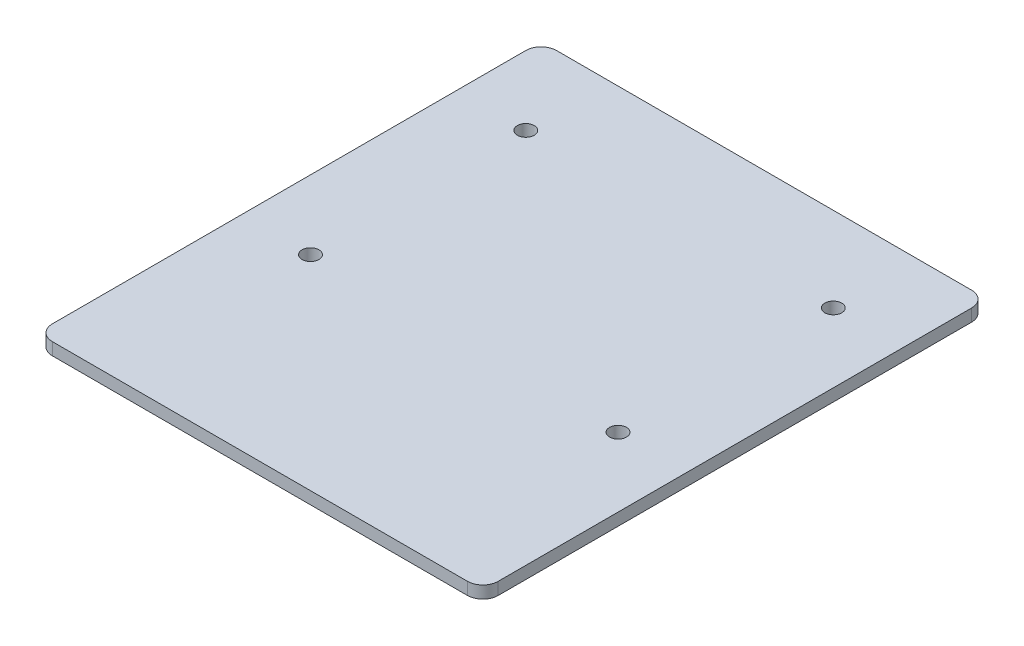
ISO-10303-21;
HEADER;
FILE_DESCRIPTION(('STEP AP214'),'2;1');
FILE_NAME('part.step','',(''),(''),'','','');
FILE_SCHEMA(('AUTOMOTIVE_DESIGN { 1 0 10303 214 1 1 1 1 }'));
ENDSEC;
DATA;
#1=APPLICATION_CONTEXT('core data for automotive mechanical design processes');
#2=APPLICATION_PROTOCOL_DEFINITION('international standard','automotive_design',2000,#1);
#3=PRODUCT_CONTEXT('',#1,'mechanical');
#4=PRODUCT('Part','Part','',(#3));
#5=PRODUCT_RELATED_PRODUCT_CATEGORY('part','',(#4));
#6=PRODUCT_DEFINITION_FORMATION('','',#4);
#7=PRODUCT_DEFINITION_CONTEXT('part definition',#1,'design');
#8=PRODUCT_DEFINITION('design','',#6,#7);
#9=PRODUCT_DEFINITION_SHAPE('','',#8);
#10=(LENGTH_UNIT() NAMED_UNIT(*) SI_UNIT(.MILLI.,.METRE.));
#11=(NAMED_UNIT(*) PLANE_ANGLE_UNIT() SI_UNIT($,.RADIAN.));
#12=(NAMED_UNIT(*) SI_UNIT($,.STERADIAN.) SOLID_ANGLE_UNIT());
#13=UNCERTAINTY_MEASURE_WITH_UNIT(LENGTH_MEASURE(1.E-05),#10,'distance_accuracy_value','');
#14=(GEOMETRIC_REPRESENTATION_CONTEXT(3) GLOBAL_UNCERTAINTY_ASSIGNED_CONTEXT((#13)) GLOBAL_UNIT_ASSIGNED_CONTEXT((#10,
#11,#12)) REPRESENTATION_CONTEXT('',''));
#15=CARTESIAN_POINT('',(0.,0.,0.));
#16=DIRECTION('',(0.,0.,1.));
#17=DIRECTION('',(1.,0.,0.));
#18=AXIS2_PLACEMENT_3D('',#15,#16,#17);
#19=CARTESIAN_POINT('',(-72.5,4.,-19.5));
#20=DIRECTION('',(1.,0.,0.));
#21=DIRECTION('',(0.,0.,-1.));
#22=AXIS2_PLACEMENT_3D('',#19,#20,#21);
#23=PLANE('',#22);
#24=DIRECTION('',(0.,0.,1.));
#25=VECTOR('',#24,1.);
#26=CARTESIAN_POINT('',(-72.5,4.,-19.5));
#27=LINE('',#26,#25);
#28=CARTESIAN_POINT('',(-72.5,4.,-14.5));
#29=VERTEX_POINT('',#28);
#30=CARTESIAN_POINT('',(-72.5,4.,139.465714830308));
#31=VERTEX_POINT('',#30);
#32=EDGE_CURVE('E127',#29,#31,#27,.T.);
#33=ORIENTED_EDGE('',*,*,#32,.F.);
#34=DIRECTION('',(0.,-1.,0.));
#35=VECTOR('',#34,1.);
#36=CARTESIAN_POINT('',(-72.5,4.,-14.5));
#37=LINE('',#36,#35);
#38=CARTESIAN_POINT('',(-72.5,0.,-14.5));
#39=VERTEX_POINT('',#38);
#40=EDGE_CURVE('E111',#29,#39,#37,.T.);
#41=ORIENTED_EDGE('',*,*,#40,.T.);
#42=DIRECTION('',(0.,0.,1.));
#43=VECTOR('',#42,1.);
#44=CARTESIAN_POINT('',(-72.5,0.,-19.5));
#45=LINE('',#44,#43);
#46=CARTESIAN_POINT('',(-72.5,0.,139.465714830308));
#47=VERTEX_POINT('',#46);
#48=EDGE_CURVE('E124',#39,#47,#45,.T.);
#49=ORIENTED_EDGE('',*,*,#48,.T.);
#50=DIRECTION('',(0.,-1.,0.));
#51=VECTOR('',#50,1.);
#52=CARTESIAN_POINT('',(-72.5,4.,139.465714830308));
#53=LINE('',#52,#51);
#54=EDGE_CURVE('E129',#47,#31,#53,.F.);
#55=ORIENTED_EDGE('',*,*,#54,.T.);
#56=EDGE_LOOP('',(#33,#41,#49,#55));
#57=FACE_BOUND('',#56,.T.);
#58=ADVANCED_FACE('F41',(#57),#23,.F.);
#59=CARTESIAN_POINT('',(-72.5,4.,144.465714830308));
#60=DIRECTION('',(0.,0.,-1.));
#61=DIRECTION('',(-1.,0.,0.));
#62=AXIS2_PLACEMENT_3D('',#59,#60,#61);
#63=PLANE('',#62);
#64=DIRECTION('',(1.,0.,0.));
#65=VECTOR('',#64,1.);
#66=CARTESIAN_POINT('',(-72.5,0.,144.465714830308));
#67=LINE('',#66,#65);
#68=CARTESIAN_POINT('',(-67.5,0.,144.465714830308));
#69=VERTEX_POINT('',#68);
#70=CARTESIAN_POINT('',(67.5,0.,144.465714830308));
#71=VERTEX_POINT('',#70);
#72=EDGE_CURVE('E135',#69,#71,#67,.T.);
#73=ORIENTED_EDGE('',*,*,#72,.T.);
#74=DIRECTION('',(0.,-1.,0.));
#75=VECTOR('',#74,1.);
#76=CARTESIAN_POINT('',(67.5,4.,144.465714830308));
#77=LINE('',#76,#75);
#78=CARTESIAN_POINT('',(67.5,4.,144.465714830308));
#79=VERTEX_POINT('',#78);
#80=EDGE_CURVE('E11',#71,#79,#77,.F.);
#81=ORIENTED_EDGE('',*,*,#80,.T.);
#82=DIRECTION('',(1.,0.,0.));
#83=VECTOR('',#82,1.);
#84=CARTESIAN_POINT('',(-72.5,4.,144.465714830308));
#85=LINE('',#84,#83);
#86=CARTESIAN_POINT('',(-67.5,4.,144.465714830308));
#87=VERTEX_POINT('',#86);
#88=EDGE_CURVE('E175',#87,#79,#85,.T.);
#89=ORIENTED_EDGE('',*,*,#88,.F.);
#90=DIRECTION('',(0.,-1.,0.));
#91=VECTOR('',#90,1.);
#92=CARTESIAN_POINT('',(-67.5,4.,144.465714830308));
#93=LINE('',#92,#91);
#94=EDGE_CURVE('E47',#87,#69,#93,.T.);
#95=ORIENTED_EDGE('',*,*,#94,.T.);
#96=EDGE_LOOP('',(#73,#81,#89,#95));
#97=FACE_BOUND('',#96,.T.);
#98=ADVANCED_FACE('F167',(#97),#63,.F.);
#99=CARTESIAN_POINT('',(72.5,4.,-19.5));
#100=DIRECTION('',(-1.,0.,0.));
#101=DIRECTION('',(0.,0.,1.));
#102=AXIS2_PLACEMENT_3D('',#99,#100,#101);
#103=PLANE('',#102);
#104=DIRECTION('',(0.,0.,-1.));
#105=VECTOR('',#104,1.);
#106=CARTESIAN_POINT('',(72.5,0.,-19.5));
#107=LINE('',#106,#105);
#108=CARTESIAN_POINT('',(72.5,0.,139.465714830308));
#109=VERTEX_POINT('',#108);
#110=CARTESIAN_POINT('',(72.5,0.,-14.5));
#111=VERTEX_POINT('',#110);
#112=EDGE_CURVE('E138',#109,#111,#107,.T.);
#113=ORIENTED_EDGE('',*,*,#112,.T.);
#114=DIRECTION('',(0.,-1.,0.));
#115=VECTOR('',#114,1.);
#116=CARTESIAN_POINT('',(72.5,4.,-14.5));
#117=LINE('',#116,#115);
#118=CARTESIAN_POINT('',(72.5,4.,-14.5));
#119=VERTEX_POINT('',#118);
#120=EDGE_CURVE('E57',#111,#119,#117,.F.);
#121=ORIENTED_EDGE('',*,*,#120,.T.);
#122=DIRECTION('',(0.,0.,-1.));
#123=VECTOR('',#122,1.);
#124=CARTESIAN_POINT('',(72.5,4.,-19.5));
#125=LINE('',#124,#123);
#126=CARTESIAN_POINT('',(72.5,4.,139.465714830308));
#127=VERTEX_POINT('',#126);
#128=EDGE_CURVE('E179',#127,#119,#125,.T.);
#129=ORIENTED_EDGE('',*,*,#128,.F.);
#130=DIRECTION('',(0.,-1.,0.));
#131=VECTOR('',#130,1.);
#132=CARTESIAN_POINT('',(72.5,4.,139.465714830308));
#133=LINE('',#132,#131);
#134=EDGE_CURVE('E161',#127,#109,#133,.T.);
#135=ORIENTED_EDGE('',*,*,#134,.T.);
#136=EDGE_LOOP('',(#113,#121,#129,#135));
#137=FACE_BOUND('',#136,.T.);
#138=ADVANCED_FACE('F177',(#137),#103,.F.);
#139=CARTESIAN_POINT('',(-72.5,4.,-19.5));
#140=DIRECTION('',(0.,0.,1.));
#141=DIRECTION('',(1.,0.,0.));
#142=AXIS2_PLACEMENT_3D('',#139,#140,#141);
#143=PLANE('',#142);
#144=DIRECTION('',(-1.,0.,0.));
#145=VECTOR('',#144,1.);
#146=CARTESIAN_POINT('',(-72.5,0.,-19.5));
#147=LINE('',#146,#145);
#148=CARTESIAN_POINT('',(67.5,0.,-19.5));
#149=VERTEX_POINT('',#148);
#150=CARTESIAN_POINT('',(-67.5,0.,-19.5));
#151=VERTEX_POINT('',#150);
#152=EDGE_CURVE('E147',#149,#151,#147,.T.);
#153=ORIENTED_EDGE('',*,*,#152,.T.);
#154=DIRECTION('',(0.,-1.,0.));
#155=VECTOR('',#154,1.);
#156=CARTESIAN_POINT('',(-67.5,4.,-19.5));
#157=LINE('',#156,#155);
#158=CARTESIAN_POINT('',(-67.5,4.,-19.5));
#159=VERTEX_POINT('',#158);
#160=EDGE_CURVE('E115',#151,#159,#157,.F.);
#161=ORIENTED_EDGE('',*,*,#160,.T.);
#162=DIRECTION('',(-1.,0.,0.));
#163=VECTOR('',#162,1.);
#164=CARTESIAN_POINT('',(-72.5,4.,-19.5));
#165=LINE('',#164,#163);
#166=CARTESIAN_POINT('',(67.5,4.,-19.5));
#167=VERTEX_POINT('',#166);
#168=EDGE_CURVE('E145',#167,#159,#165,.T.);
#169=ORIENTED_EDGE('',*,*,#168,.F.);
#170=DIRECTION('',(0.,-1.,0.));
#171=VECTOR('',#170,1.);
#172=CARTESIAN_POINT('',(67.5,4.,-19.5));
#173=LINE('',#172,#171);
#174=EDGE_CURVE('E120',#167,#149,#173,.T.);
#175=ORIENTED_EDGE('',*,*,#174,.T.);
#176=EDGE_LOOP('',(#153,#161,#169,#175));
#177=FACE_BOUND('',#176,.T.);
#178=ADVANCED_FACE('F215',(#177),#143,.F.);
#179=CARTESIAN_POINT('',(0.,4.,0.));
#180=DIRECTION('',(0.,1.,0.));
#181=DIRECTION('',(0.,0.,1.));
#182=AXIS2_PLACEMENT_3D('',#179,#180,#181);
#183=PLANE('',#182);
#184=CARTESIAN_POINT('',(-50.,4.,78.));
#185=DIRECTION('',(0.,1.,0.));
#186=DIRECTION('',(0.,0.,1.));
#187=AXIS2_PLACEMENT_3D('',#184,#185,#186);
#188=CIRCLE('',#187,2.75);
#189=CARTESIAN_POINT('',(-50.,4.,80.75));
#190=VERTEX_POINT('',#189);
#191=EDGE_CURVE('E190',#190,#190,#188,.T.);
#192=ORIENTED_EDGE('',*,*,#191,.F.);
#193=EDGE_LOOP('',(#192));
#194=FACE_BOUND('',#193,.T.);
#195=CARTESIAN_POINT('',(50.,4.,8.));
#196=DIRECTION('',(0.,1.,0.));
#197=DIRECTION('',(0.,0.,1.));
#198=AXIS2_PLACEMENT_3D('',#195,#196,#197);
#199=CIRCLE('',#198,2.75);
#200=CARTESIAN_POINT('',(50.,4.,10.75));
#201=VERTEX_POINT('',#200);
#202=EDGE_CURVE('E195',#201,#201,#199,.T.);
#203=ORIENTED_EDGE('',*,*,#202,.F.);
#204=EDGE_LOOP('',(#203));
#205=FACE_BOUND('',#204,.T.);
#206=CARTESIAN_POINT('',(50.,4.,78.));
#207=DIRECTION('',(0.,1.,0.));
#208=DIRECTION('',(0.,0.,1.));
#209=AXIS2_PLACEMENT_3D('',#206,#207,#208);
#210=CIRCLE('',#209,2.75);
#211=CARTESIAN_POINT('',(50.,4.,80.75));
#212=VERTEX_POINT('',#211);
#213=EDGE_CURVE('E194',#212,#212,#210,.T.);
#214=ORIENTED_EDGE('',*,*,#213,.F.);
#215=EDGE_LOOP('',(#214));
#216=FACE_BOUND('',#215,.T.);
#217=CARTESIAN_POINT('',(-50.,4.,8.));
#218=DIRECTION('',(0.,1.,0.));
#219=DIRECTION('',(0.,0.,1.));
#220=AXIS2_PLACEMENT_3D('',#217,#218,#219);
#221=CIRCLE('',#220,2.75);
#222=CARTESIAN_POINT('',(-50.,4.,10.75));
#223=VERTEX_POINT('',#222);
#224=EDGE_CURVE('E139',#223,#223,#221,.T.);
#225=ORIENTED_EDGE('',*,*,#224,.F.);
#226=EDGE_LOOP('',(#225));
#227=FACE_BOUND('',#226,.T.);
#228=ORIENTED_EDGE('',*,*,#168,.T.);
#229=CARTESIAN_POINT('',(-67.5,4.,-14.5));
#230=DIRECTION('',(0.,1.,0.));
#231=DIRECTION('',(0.,0.,1.));
#232=AXIS2_PLACEMENT_3D('',#229,#230,#231);
#233=CIRCLE('',#232,5.);
#234=EDGE_CURVE('E163',#159,#29,#233,.T.);
#235=ORIENTED_EDGE('',*,*,#234,.T.);
#236=ORIENTED_EDGE('',*,*,#32,.T.);
#237=CARTESIAN_POINT('',(-67.5,4.,139.465714830308));
#238=DIRECTION('',(0.,1.,0.));
#239=DIRECTION('',(0.,0.,1.));
#240=AXIS2_PLACEMENT_3D('',#237,#238,#239);
#241=CIRCLE('',#240,5.);
#242=EDGE_CURVE('E158',#31,#87,#241,.T.);
#243=ORIENTED_EDGE('',*,*,#242,.T.);
#244=ORIENTED_EDGE('',*,*,#88,.T.);
#245=CARTESIAN_POINT('',(67.5,4.,139.465714830308));
#246=DIRECTION('',(0.,1.,0.));
#247=DIRECTION('',(0.,0.,1.));
#248=AXIS2_PLACEMENT_3D('',#245,#246,#247);
#249=CIRCLE('',#248,5.);
#250=EDGE_CURVE('E64',#79,#127,#249,.T.);
#251=ORIENTED_EDGE('',*,*,#250,.T.);
#252=ORIENTED_EDGE('',*,*,#128,.T.);
#253=CARTESIAN_POINT('',(67.5,4.,-14.5));
#254=DIRECTION('',(0.,1.,0.));
#255=DIRECTION('',(0.,0.,1.));
#256=AXIS2_PLACEMENT_3D('',#253,#254,#255);
#257=CIRCLE('',#256,5.);
#258=EDGE_CURVE('E159',#119,#167,#257,.T.);
#259=ORIENTED_EDGE('',*,*,#258,.T.);
#260=EDGE_LOOP('',(#228,#235,#236,#243,#244,#251,#252,#259));
#261=FACE_BOUND('',#260,.T.);
#262=ADVANCED_FACE('F209',(#194,#205,#216,#227,#261),#183,.T.);
#263=CARTESIAN_POINT('',(0.,0.,0.));
#264=DIRECTION('',(0.,1.,0.));
#265=DIRECTION('',(0.,0.,1.));
#266=AXIS2_PLACEMENT_3D('',#263,#264,#265);
#267=PLANE('',#266);
#268=CARTESIAN_POINT('',(-50.,0.,78.));
#269=DIRECTION('',(0.,1.,0.));
#270=DIRECTION('',(0.,0.,1.));
#271=AXIS2_PLACEMENT_3D('',#268,#269,#270);
#272=CIRCLE('',#271,2.75);
#273=CARTESIAN_POINT('',(-50.,0.,80.75));
#274=VERTEX_POINT('',#273);
#275=EDGE_CURVE('E196',#274,#274,#272,.T.);
#276=ORIENTED_EDGE('',*,*,#275,.T.);
#277=EDGE_LOOP('',(#276));
#278=FACE_BOUND('',#277,.T.);
#279=CARTESIAN_POINT('',(50.,0.,8.));
#280=DIRECTION('',(0.,1.,0.));
#281=DIRECTION('',(0.,0.,1.));
#282=AXIS2_PLACEMENT_3D('',#279,#280,#281);
#283=CIRCLE('',#282,2.75);
#284=CARTESIAN_POINT('',(50.,0.,10.75));
#285=VERTEX_POINT('',#284);
#286=EDGE_CURVE('E186',#285,#285,#283,.T.);
#287=ORIENTED_EDGE('',*,*,#286,.T.);
#288=EDGE_LOOP('',(#287));
#289=FACE_BOUND('',#288,.T.);
#290=CARTESIAN_POINT('',(50.,0.,78.));
#291=DIRECTION('',(0.,1.,0.));
#292=DIRECTION('',(0.,0.,1.));
#293=AXIS2_PLACEMENT_3D('',#290,#291,#292);
#294=CIRCLE('',#293,2.75);
#295=CARTESIAN_POINT('',(50.,0.,80.75));
#296=VERTEX_POINT('',#295);
#297=EDGE_CURVE('E203',#296,#296,#294,.T.);
#298=ORIENTED_EDGE('',*,*,#297,.T.);
#299=EDGE_LOOP('',(#298));
#300=FACE_BOUND('',#299,.T.);
#301=CARTESIAN_POINT('',(-50.,0.,8.));
#302=DIRECTION('',(0.,1.,0.));
#303=DIRECTION('',(0.,0.,1.));
#304=AXIS2_PLACEMENT_3D('',#301,#302,#303);
#305=CIRCLE('',#304,2.75);
#306=CARTESIAN_POINT('',(-50.,0.,10.75));
#307=VERTEX_POINT('',#306);
#308=EDGE_CURVE('E132',#307,#307,#305,.T.);
#309=ORIENTED_EDGE('',*,*,#308,.T.);
#310=EDGE_LOOP('',(#309));
#311=FACE_BOUND('',#310,.T.);
#312=ORIENTED_EDGE('',*,*,#48,.F.);
#313=CARTESIAN_POINT('',(-67.5,0.,-14.5));
#314=DIRECTION('',(0.,1.,0.));
#315=DIRECTION('',(0.,0.,1.));
#316=AXIS2_PLACEMENT_3D('',#313,#314,#315);
#317=CIRCLE('',#316,5.);
#318=EDGE_CURVE('E110',#39,#151,#317,.F.);
#319=ORIENTED_EDGE('',*,*,#318,.T.);
#320=ORIENTED_EDGE('',*,*,#152,.F.);
#321=CARTESIAN_POINT('',(67.5,0.,-14.5));
#322=DIRECTION('',(0.,1.,0.));
#323=DIRECTION('',(0.,0.,1.));
#324=AXIS2_PLACEMENT_3D('',#321,#322,#323);
#325=CIRCLE('',#324,5.);
#326=EDGE_CURVE('E117',#149,#111,#325,.F.);
#327=ORIENTED_EDGE('',*,*,#326,.T.);
#328=ORIENTED_EDGE('',*,*,#112,.F.);
#329=CARTESIAN_POINT('',(67.5,0.,139.465714830308));
#330=DIRECTION('',(0.,1.,0.));
#331=DIRECTION('',(0.,0.,1.));
#332=AXIS2_PLACEMENT_3D('',#329,#330,#331);
#333=CIRCLE('',#332,5.);
#334=EDGE_CURVE('E148',#109,#71,#333,.F.);
#335=ORIENTED_EDGE('',*,*,#334,.T.);
#336=ORIENTED_EDGE('',*,*,#72,.F.);
#337=CARTESIAN_POINT('',(-67.5,0.,139.465714830308));
#338=DIRECTION('',(0.,1.,0.));
#339=DIRECTION('',(0.,0.,1.));
#340=AXIS2_PLACEMENT_3D('',#337,#338,#339);
#341=CIRCLE('',#340,5.);
#342=EDGE_CURVE('E130',#69,#47,#341,.F.);
#343=ORIENTED_EDGE('',*,*,#342,.T.);
#344=EDGE_LOOP('',(#312,#319,#320,#327,#328,#335,#336,#343));
#345=FACE_BOUND('',#344,.T.);
#346=ADVANCED_FACE('F128',(#278,#289,#300,#311,#345),#267,.F.);
#347=CARTESIAN_POINT('',(-50.,0.,8.));
#348=DIRECTION('',(0.,1.,0.));
#349=DIRECTION('',(0.,0.,1.));
#350=AXIS2_PLACEMENT_3D('',#347,#348,#349);
#351=CYLINDRICAL_SURFACE('',#350,2.75);
#352=ORIENTED_EDGE('',*,*,#308,.F.);
#353=EDGE_LOOP('',(#352));
#354=FACE_BOUND('',#353,.T.);
#355=ORIENTED_EDGE('',*,*,#224,.T.);
#356=EDGE_LOOP('',(#355));
#357=FACE_BOUND('',#356,.T.);
#358=ADVANCED_FACE('F245',(#354,#357),#351,.F.);
#359=CARTESIAN_POINT('',(50.,0.,78.));
#360=DIRECTION('',(0.,1.,0.));
#361=DIRECTION('',(0.,0.,1.));
#362=AXIS2_PLACEMENT_3D('',#359,#360,#361);
#363=CYLINDRICAL_SURFACE('',#362,2.75);
#364=ORIENTED_EDGE('',*,*,#297,.F.);
#365=EDGE_LOOP('',(#364));
#366=FACE_BOUND('',#365,.T.);
#367=ORIENTED_EDGE('',*,*,#213,.T.);
#368=EDGE_LOOP('',(#367));
#369=FACE_BOUND('',#368,.T.);
#370=ADVANCED_FACE('F210',(#366,#369),#363,.F.);
#371=CARTESIAN_POINT('',(50.,0.,8.));
#372=DIRECTION('',(0.,1.,0.));
#373=DIRECTION('',(0.,0.,1.));
#374=AXIS2_PLACEMENT_3D('',#371,#372,#373);
#375=CYLINDRICAL_SURFACE('',#374,2.75);
#376=ORIENTED_EDGE('',*,*,#286,.F.);
#377=EDGE_LOOP('',(#376));
#378=FACE_BOUND('',#377,.T.);
#379=ORIENTED_EDGE('',*,*,#202,.T.);
#380=EDGE_LOOP('',(#379));
#381=FACE_BOUND('',#380,.T.);
#382=ADVANCED_FACE('F247',(#378,#381),#375,.F.);
#383=CARTESIAN_POINT('',(-50.,0.,78.));
#384=DIRECTION('',(0.,1.,0.));
#385=DIRECTION('',(0.,0.,1.));
#386=AXIS2_PLACEMENT_3D('',#383,#384,#385);
#387=CYLINDRICAL_SURFACE('',#386,2.75);
#388=ORIENTED_EDGE('',*,*,#275,.F.);
#389=EDGE_LOOP('',(#388));
#390=FACE_BOUND('',#389,.T.);
#391=ORIENTED_EDGE('',*,*,#191,.T.);
#392=EDGE_LOOP('',(#391));
#393=FACE_BOUND('',#392,.T.);
#394=ADVANCED_FACE('F227',(#390,#393),#387,.F.);
#395=CARTESIAN_POINT('',(-67.5,4.,-14.5));
#396=DIRECTION('',(0.,-1.,0.));
#397=DIRECTION('',(0.,0.,-1.));
#398=AXIS2_PLACEMENT_3D('',#395,#396,#397);
#399=CYLINDRICAL_SURFACE('',#398,5.);
#400=ORIENTED_EDGE('',*,*,#234,.F.);
#401=ORIENTED_EDGE('',*,*,#160,.F.);
#402=ORIENTED_EDGE('',*,*,#318,.F.);
#403=ORIENTED_EDGE('',*,*,#40,.F.);
#404=EDGE_LOOP('',(#400,#401,#402,#403));
#405=FACE_BOUND('',#404,.T.);
#406=ADVANCED_FACE('F109',(#405),#399,.T.);
#407=CARTESIAN_POINT('',(67.5,4.,-14.5));
#408=DIRECTION('',(0.,-1.,0.));
#409=DIRECTION('',(0.,0.,-1.));
#410=AXIS2_PLACEMENT_3D('',#407,#408,#409);
#411=CYLINDRICAL_SURFACE('',#410,5.);
#412=ORIENTED_EDGE('',*,*,#258,.F.);
#413=ORIENTED_EDGE('',*,*,#120,.F.);
#414=ORIENTED_EDGE('',*,*,#326,.F.);
#415=ORIENTED_EDGE('',*,*,#174,.F.);
#416=EDGE_LOOP('',(#412,#413,#414,#415));
#417=FACE_BOUND('',#416,.T.);
#418=ADVANCED_FACE('F219',(#417),#411,.T.);
#419=CARTESIAN_POINT('',(67.5,4.,139.465714830308));
#420=DIRECTION('',(0.,-1.,0.));
#421=DIRECTION('',(0.,0.,-1.));
#422=AXIS2_PLACEMENT_3D('',#419,#420,#421);
#423=CYLINDRICAL_SURFACE('',#422,5.);
#424=ORIENTED_EDGE('',*,*,#250,.F.);
#425=ORIENTED_EDGE('',*,*,#80,.F.);
#426=ORIENTED_EDGE('',*,*,#334,.F.);
#427=ORIENTED_EDGE('',*,*,#134,.F.);
#428=EDGE_LOOP('',(#424,#425,#426,#427));
#429=FACE_BOUND('',#428,.T.);
#430=ADVANCED_FACE('F178',(#429),#423,.T.);
#431=CARTESIAN_POINT('',(-67.5,4.,139.465714830308));
#432=DIRECTION('',(0.,-1.,0.));
#433=DIRECTION('',(0.,0.,-1.));
#434=AXIS2_PLACEMENT_3D('',#431,#432,#433);
#435=CYLINDRICAL_SURFACE('',#434,5.);
#436=ORIENTED_EDGE('',*,*,#242,.F.);
#437=ORIENTED_EDGE('',*,*,#54,.F.);
#438=ORIENTED_EDGE('',*,*,#342,.F.);
#439=ORIENTED_EDGE('',*,*,#94,.F.);
#440=EDGE_LOOP('',(#436,#437,#438,#439));
#441=FACE_BOUND('',#440,.T.);
#442=ADVANCED_FACE('F43',(#441),#435,.T.);
#443=CLOSED_SHELL('',(#58,#98,#138,#178,#262,#346,#358,#370,#382,#394,#406,#418,#430,#442));
#444=MANIFOLD_SOLID_BREP('B2',#443);
#445=ADVANCED_BREP_SHAPE_REPRESENTATION('',(#18,#444),#14);
#446=SHAPE_DEFINITION_REPRESENTATION(#9,#445);
ENDSEC;
END-ISO-10303-21;
